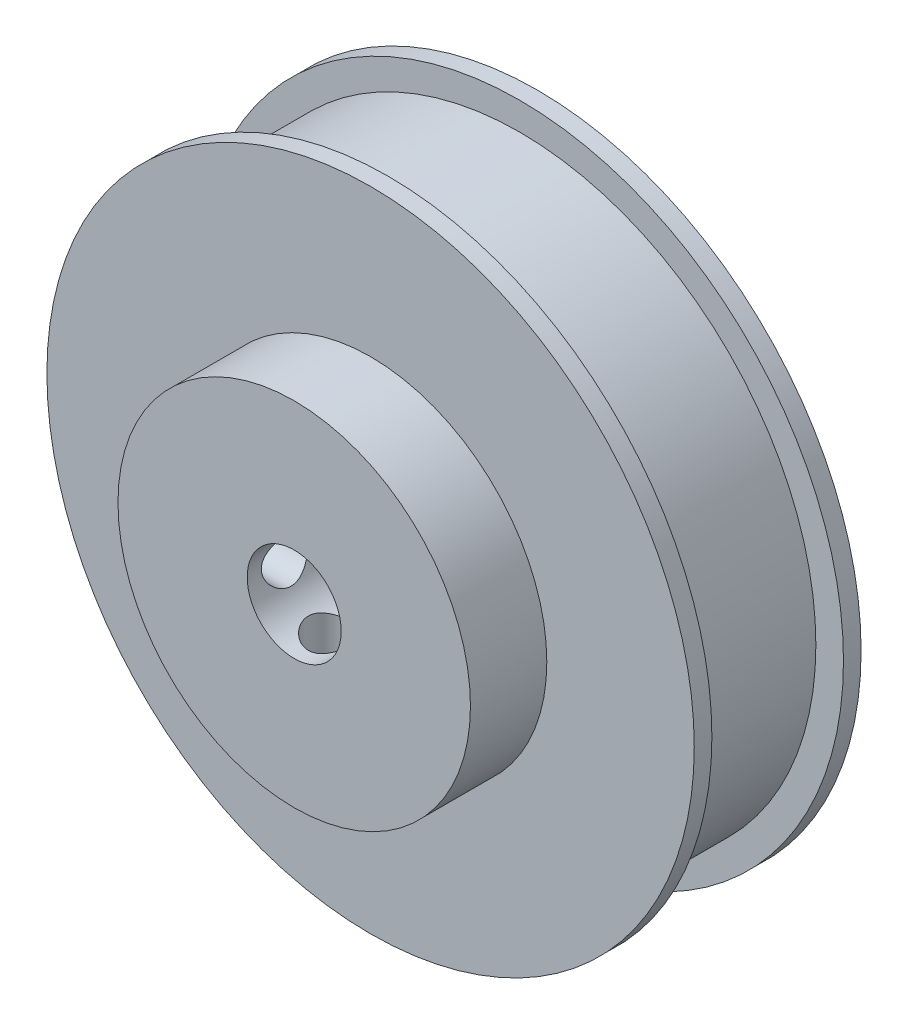
ISO-10303-21;
HEADER;
FILE_DESCRIPTION(('STEP AP214'),'2;1');
FILE_NAME('part.step','',(''),(''),'','','');
FILE_SCHEMA(('AUTOMOTIVE_DESIGN { 1 0 10303 214 1 1 1 1 }'));
ENDSEC;
DATA;
#1=APPLICATION_CONTEXT('core data for automotive mechanical design processes');
#2=APPLICATION_PROTOCOL_DEFINITION('international standard','automotive_design',2000,#1);
#3=PRODUCT_CONTEXT('',#1,'mechanical');
#4=PRODUCT('Part','Part','',(#3));
#5=PRODUCT_RELATED_PRODUCT_CATEGORY('part','',(#4));
#6=PRODUCT_DEFINITION_FORMATION('','',#4);
#7=PRODUCT_DEFINITION_CONTEXT('part definition',#1,'design');
#8=PRODUCT_DEFINITION('design','',#6,#7);
#9=PRODUCT_DEFINITION_SHAPE('','',#8);
#10=(LENGTH_UNIT() NAMED_UNIT(*) SI_UNIT(.MILLI.,.METRE.));
#11=(NAMED_UNIT(*) PLANE_ANGLE_UNIT() SI_UNIT($,.RADIAN.));
#12=(NAMED_UNIT(*) SI_UNIT($,.STERADIAN.) SOLID_ANGLE_UNIT());
#13=UNCERTAINTY_MEASURE_WITH_UNIT(LENGTH_MEASURE(1.E-05),#10,'distance_accuracy_value','');
#14=(GEOMETRIC_REPRESENTATION_CONTEXT(3) GLOBAL_UNCERTAINTY_ASSIGNED_CONTEXT((#13)) GLOBAL_UNIT_ASSIGNED_CONTEXT((#10,
#11,#12)) REPRESENTATION_CONTEXT('',''));
#15=CARTESIAN_POINT('',(0.,0.,0.));
#16=DIRECTION('',(0.,0.,1.));
#17=DIRECTION('',(1.,0.,0.));
#18=AXIS2_PLACEMENT_3D('',#15,#16,#17);
#19=CARTESIAN_POINT('',(0.,0.,14.2));
#20=DIRECTION('',(0.,0.,1.));
#21=DIRECTION('',(1.,0.,0.));
#22=AXIS2_PLACEMENT_3D('',#19,#20,#21);
#23=PLANE('',#22);
#24=CARTESIAN_POINT('',(0.,0.,14.2));
#25=DIRECTION('',(0.,0.,1.));
#26=DIRECTION('',(1.,0.,0.));
#27=AXIS2_PLACEMENT_3D('',#24,#25,#26);
#28=CIRCLE('',#27,27.55);
#29=CARTESIAN_POINT('',(27.55,0.,14.2));
#30=VERTEX_POINT('',#29);
#31=EDGE_CURVE('E144',#30,#30,#28,.T.);
#32=ORIENTED_EDGE('',*,*,#31,.T.);
#33=EDGE_LOOP('',(#32));
#34=FACE_BOUND('',#33,.T.);
#35=CARTESIAN_POINT('',(0.,0.,14.2));
#36=DIRECTION('',(0.,0.,1.));
#37=DIRECTION('',(1.,0.,0.));
#38=AXIS2_PLACEMENT_3D('',#35,#36,#37);
#39=CIRCLE('',#38,15.);
#40=CARTESIAN_POINT('',(15.,0.,14.2));
#41=VERTEX_POINT('',#40);
#42=EDGE_CURVE('E59',#41,#41,#39,.T.);
#43=ORIENTED_EDGE('',*,*,#42,.F.);
#44=EDGE_LOOP('',(#43));
#45=FACE_BOUND('',#44,.T.);
#46=ADVANCED_FACE('F31',(#34,#45),#23,.T.);
#47=CARTESIAN_POINT('',(0.,0.,1.5));
#48=DIRECTION('',(0.,0.,1.));
#49=DIRECTION('',(1.,0.,0.));
#50=AXIS2_PLACEMENT_3D('',#47,#48,#49);
#51=PLANE('',#50);
#52=CARTESIAN_POINT('',(0.,0.,1.5));
#53=DIRECTION('',(0.,0.,1.));
#54=DIRECTION('',(1.,0.,0.));
#55=AXIS2_PLACEMENT_3D('',#52,#53,#54);
#56=CIRCLE('',#55,27.55);
#57=CARTESIAN_POINT('',(27.55,0.,1.5));
#58=VERTEX_POINT('',#57);
#59=EDGE_CURVE('E10',#58,#58,#56,.T.);
#60=ORIENTED_EDGE('',*,*,#59,.T.);
#61=EDGE_LOOP('',(#60));
#62=FACE_BOUND('',#61,.T.);
#63=CARTESIAN_POINT('',(0.,0.,1.5));
#64=DIRECTION('',(0.,0.,1.));
#65=DIRECTION('',(1.,0.,0.));
#66=AXIS2_PLACEMENT_3D('',#63,#64,#65);
#67=CIRCLE('',#66,25.2);
#68=CARTESIAN_POINT('',(25.2,0.,1.5));
#69=VERTEX_POINT('',#68);
#70=EDGE_CURVE('E51',#69,#69,#67,.T.);
#71=ORIENTED_EDGE('',*,*,#70,.F.);
#72=EDGE_LOOP('',(#71));
#73=FACE_BOUND('',#72,.T.);
#74=ADVANCED_FACE('F97',(#62,#73),#51,.T.);
#75=CARTESIAN_POINT('',(0.,0.,1.5));
#76=DIRECTION('',(0.,0.,-1.));
#77=DIRECTION('',(-1.,0.,0.));
#78=AXIS2_PLACEMENT_3D('',#75,#76,#77);
#79=CYLINDRICAL_SURFACE('',#78,27.55);
#80=ORIENTED_EDGE('',*,*,#59,.F.);
#81=EDGE_LOOP('',(#80));
#82=FACE_BOUND('',#81,.T.);
#83=CARTESIAN_POINT('',(0.,0.,0.));
#84=DIRECTION('',(0.,0.,1.));
#85=DIRECTION('',(1.,0.,0.));
#86=AXIS2_PLACEMENT_3D('',#83,#84,#85);
#87=CIRCLE('',#86,27.55);
#88=CARTESIAN_POINT('',(27.55,0.,0.));
#89=VERTEX_POINT('',#88);
#90=EDGE_CURVE('E43',#89,#89,#87,.T.);
#91=ORIENTED_EDGE('',*,*,#90,.T.);
#92=EDGE_LOOP('',(#91));
#93=FACE_BOUND('',#92,.T.);
#94=ADVANCED_FACE('F33',(#82,#93),#79,.T.);
#95=CARTESIAN_POINT('',(0.,0.,0.));
#96=DIRECTION('',(0.,0.,1.));
#97=DIRECTION('',(1.,0.,0.));
#98=AXIS2_PLACEMENT_3D('',#95,#96,#97);
#99=PLANE('',#98);
#100=CARTESIAN_POINT('',(0.,0.,0.));
#101=DIRECTION('',(0.,0.,1.));
#102=DIRECTION('',(1.,0.,0.));
#103=AXIS2_PLACEMENT_3D('',#100,#101,#102);
#104=CIRCLE('',#103,4.);
#105=CARTESIAN_POINT('',(4.,0.,0.));
#106=VERTEX_POINT('',#105);
#107=EDGE_CURVE('E127',#106,#106,#104,.T.);
#108=ORIENTED_EDGE('',*,*,#107,.T.);
#109=EDGE_LOOP('',(#108));
#110=FACE_BOUND('',#109,.T.);
#111=ORIENTED_EDGE('',*,*,#90,.F.);
#112=EDGE_LOOP('',(#111));
#113=FACE_BOUND('',#112,.T.);
#114=ADVANCED_FACE('F116',(#110,#113),#99,.F.);
#115=CARTESIAN_POINT('',(0.,0.,12.7));
#116=DIRECTION('',(0.,0.,-1.));
#117=DIRECTION('',(-1.,0.,0.));
#118=AXIS2_PLACEMENT_3D('',#115,#116,#117);
#119=CYLINDRICAL_SURFACE('',#118,25.2);
#120=CARTESIAN_POINT('',(0.,0.,12.7));
#121=DIRECTION('',(0.,0.,1.));
#122=DIRECTION('',(1.,0.,0.));
#123=AXIS2_PLACEMENT_3D('',#120,#121,#122);
#124=CIRCLE('',#123,25.2);
#125=CARTESIAN_POINT('',(25.2,0.,12.7));
#126=VERTEX_POINT('',#125);
#127=EDGE_CURVE('E48',#126,#126,#124,.T.);
#128=ORIENTED_EDGE('',*,*,#127,.F.);
#129=EDGE_LOOP('',(#128));
#130=FACE_BOUND('',#129,.T.);
#131=ORIENTED_EDGE('',*,*,#70,.T.);
#132=EDGE_LOOP('',(#131));
#133=FACE_BOUND('',#132,.T.);
#134=ADVANCED_FACE('F110',(#130,#133),#119,.T.);
#135=CARTESIAN_POINT('',(0.,0.,12.7));
#136=DIRECTION('',(0.,0.,1.));
#137=DIRECTION('',(1.,0.,0.));
#138=AXIS2_PLACEMENT_3D('',#135,#136,#137);
#139=PLANE('',#138);
#140=CARTESIAN_POINT('',(0.,0.,12.7));
#141=DIRECTION('',(0.,0.,1.));
#142=DIRECTION('',(1.,0.,0.));
#143=AXIS2_PLACEMENT_3D('',#140,#141,#142);
#144=CIRCLE('',#143,27.55);
#145=CARTESIAN_POINT('',(27.55,0.,12.7));
#146=VERTEX_POINT('',#145);
#147=EDGE_CURVE('E142',#146,#146,#144,.T.);
#148=ORIENTED_EDGE('',*,*,#147,.F.);
#149=EDGE_LOOP('',(#148));
#150=FACE_BOUND('',#149,.T.);
#151=ORIENTED_EDGE('',*,*,#127,.T.);
#152=EDGE_LOOP('',(#151));
#153=FACE_BOUND('',#152,.T.);
#154=ADVANCED_FACE('F106',(#150,#153),#139,.F.);
#155=CARTESIAN_POINT('',(0.,0.,14.2));
#156=DIRECTION('',(0.,0.,-1.));
#157=DIRECTION('',(-1.,0.,0.));
#158=AXIS2_PLACEMENT_3D('',#155,#156,#157);
#159=CYLINDRICAL_SURFACE('',#158,27.55);
#160=ORIENTED_EDGE('',*,*,#31,.F.);
#161=EDGE_LOOP('',(#160));
#162=FACE_BOUND('',#161,.T.);
#163=ORIENTED_EDGE('',*,*,#147,.T.);
#164=EDGE_LOOP('',(#163));
#165=FACE_BOUND('',#164,.T.);
#166=ADVANCED_FACE('F109',(#162,#165),#159,.T.);
#167=CARTESIAN_POINT('',(0.,0.,20.7));
#168=DIRECTION('',(0.,0.,-1.));
#169=DIRECTION('',(-1.,0.,0.));
#170=AXIS2_PLACEMENT_3D('',#167,#168,#169);
#171=CYLINDRICAL_SURFACE('',#170,15.);
#172=CARTESIAN_POINT('',(-15.,0.,19.5));
#173=CARTESIAN_POINT('',(-14.9999983574254,-0.111808835669284,19.4999952902931));
#174=CARTESIAN_POINT('',(-14.9987367072719,-0.22368597927628,19.4905924620375));
#175=CARTESIAN_POINT('',(-14.993825111269,-0.444322725138079,19.4532336509504));
#176=CARTESIAN_POINT('',(-14.9901727244172,-0.553079022333037,19.4252587051029));
#177=CARTESIAN_POINT('',(-14.9808907984907,-0.764248312626984,19.3515982824586));
#178=CARTESIAN_POINT('',(-14.9752626421097,-0.866665683058493,19.3059251889616));
#179=CARTESIAN_POINT('',(-14.9626538666039,-1.0623638950303,19.1981930861937));
#180=CARTESIAN_POINT('',(-14.9556734655857,-1.15564620633703,19.1361367188335));
#181=CARTESIAN_POINT('',(-14.9410899478996,-1.33102582250468,18.9969867383958));
#182=CARTESIAN_POINT('',(-14.9334835816211,-1.41305798549586,18.9198113549915));
#183=CARTESIAN_POINT('',(-14.9185313755795,-1.56304735673102,18.7527898109233));
#184=CARTESIAN_POINT('',(-14.9111855496234,-1.63100381997221,18.6629429800042));
#185=CARTESIAN_POINT('',(-14.8975543544019,-1.75115902268907,18.472700877055));
#186=CARTESIAN_POINT('',(-14.8912731776576,-1.80329607482578,18.3722663175214));
#187=CARTESIAN_POINT('',(-14.8805258737923,-1.8899384500729,18.1639689327632));
#188=CARTESIAN_POINT('',(-14.8760596685121,-1.92444453245278,18.0561064276467));
#189=CARTESIAN_POINT('',(-14.8694793656867,-1.97464606772174,17.8366941894984));
#190=CARTESIAN_POINT('',(-14.8673514537014,-1.99045204228507,17.7251701654671));
#191=CARTESIAN_POINT('',(-14.8656465160931,-2.00314680548117,17.501033820394));
#192=CARTESIAN_POINT('',(-14.866069374204,-2.00003645633601,17.3884215491891));
#193=CARTESIAN_POINT('',(-14.8694055577299,-1.97507745939235,17.1660788699721));
#194=CARTESIAN_POINT('',(-14.8723026462234,-1.95335097531762,17.0563344701143));
#195=CARTESIAN_POINT('',(-14.8802355277475,-1.89196724634372,16.8420631632399));
#196=CARTESIAN_POINT('',(-14.8852713695413,-1.85230959261458,16.737536375245));
#197=CARTESIAN_POINT('',(-14.8969326111103,-1.75605929143191,16.5362903652928));
#198=CARTESIAN_POINT('',(-14.903562941239,-1.69941397913749,16.4395966288057));
#199=CARTESIAN_POINT('',(-14.9176623621993,-1.57083393344289,16.2570409180823));
#200=CARTESIAN_POINT('',(-14.9251314966353,-1.49889840502385,16.1711795074458));
#201=CARTESIAN_POINT('',(-14.9401389923359,-1.34110490026363,16.0120169874181));
#202=CARTESIAN_POINT('',(-14.947677435412,-1.25514170702645,15.9388201572977));
#203=CARTESIAN_POINT('',(-14.9619192381826,-1.07209417013341,15.8078779550716));
#204=CARTESIAN_POINT('',(-14.9686225954715,-0.975009794442371,15.7501326274765));
#205=CARTESIAN_POINT('',(-14.9804439374358,-0.772392219730472,15.6517308823053));
#206=CARTESIAN_POINT('',(-14.9855612720896,-0.666855578841232,15.6110814689537));
#207=CARTESIAN_POINT('',(-14.9936282590407,-0.450370924336252,15.5481106810277));
#208=CARTESIAN_POINT('',(-14.9965780268993,-0.33942319954226,15.5257883293606));
#209=CARTESIAN_POINT('',(-14.9999624137686,-0.116166903325648,15.5002415672289));
#210=CARTESIAN_POINT('',(-15.0004159384905,-0.00387503454704613,15.4968735982165));
#211=CARTESIAN_POINT('',(-14.9988079153852,0.219671617218714,15.5089516641272));
#212=CARTESIAN_POINT('',(-14.996746428686,0.330926425345661,15.5243972417824));
#213=CARTESIAN_POINT('',(-14.990351753581,0.548813715572934,15.573544653384));
#214=CARTESIAN_POINT('',(-14.9860271430292,0.655462016512041,15.6071775683222));
#215=CARTESIAN_POINT('',(-14.9755900925429,0.861605098793556,15.6916729659371));
#216=CARTESIAN_POINT('',(-14.9694775843944,0.961099607015634,15.7425361060133));
#217=CARTESIAN_POINT('',(-14.9560983737007,1.15074887861607,15.8603921555833));
#218=CARTESIAN_POINT('',(-14.9488251504572,1.2408458143966,15.9274773657133));
#219=CARTESIAN_POINT('',(-14.9339572870998,1.40855294699189,16.0757433292243));
#220=CARTESIAN_POINT('',(-14.9263626324062,1.48616257662378,16.1569247225164));
#221=CARTESIAN_POINT('',(-14.9116490247351,1.62720549423098,16.3317131426396));
#222=CARTESIAN_POINT('',(-14.904533487753,1.69054327608938,16.4253975667382));
#223=CARTESIAN_POINT('',(-14.8916413300182,1.80058351078813,16.6221594102809));
#224=CARTESIAN_POINT('',(-14.8858646793678,1.84728633510346,16.7252366199104));
#225=CARTESIAN_POINT('',(-14.8763281178008,1.92257836500746,16.9375572420277));
#226=CARTESIAN_POINT('',(-14.872562342326,1.95122028846795,17.0467816852108));
#227=CARTESIAN_POINT('',(-14.8674574869829,1.98974667143958,17.2685436321288));
#228=CARTESIAN_POINT('',(-14.8661182773134,1.99963213426781,17.3810809583244));
#229=CARTESIAN_POINT('',(-14.8660223129545,2.00034485806189,17.6053234908535));
#230=CARTESIAN_POINT('',(-14.8672452228252,1.99132219194492,17.7170282409642));
#231=CARTESIAN_POINT('',(-14.872091838742,1.95479376686689,17.9373178751039));
#232=CARTESIAN_POINT('',(-14.8757155438883,1.92728801483268,18.045902760302));
#233=CARTESIAN_POINT('',(-14.8849489027276,1.85462310332207,18.2568436832516));
#234=CARTESIAN_POINT('',(-14.890557626594,1.80947220819041,18.3592026111169));
#235=CARTESIAN_POINT('',(-14.9031304571282,1.70281342759737,18.5549158838261));
#236=CARTESIAN_POINT('',(-14.910094589966,1.64130522630428,18.648270054756));
#237=CARTESIAN_POINT('',(-14.9246596718306,1.50312448509508,18.8240896499284));
#238=CARTESIAN_POINT('',(-14.9322650575408,1.42634027226901,18.9064669477551));
#239=CARTESIAN_POINT('',(-14.9472171900166,1.26002169349824,19.0572232163615));
#240=CARTESIAN_POINT('',(-14.9545638756898,1.17048434072977,19.1255988987502));
#241=CARTESIAN_POINT('',(-14.9682063513753,0.980752987852819,19.2466671384665));
#242=CARTESIAN_POINT('',(-14.9744974642689,0.880514620743964,19.2992906665552));
#243=CARTESIAN_POINT('',(-14.9852732065897,0.672592409587328,19.3868805985451));
#244=CARTESIAN_POINT('',(-14.9897597692431,0.564916678969889,19.4218659086249));
#245=CARTESIAN_POINT('',(-14.9953572174327,0.380588408098419,19.4649480063852));
#246=CARTESIAN_POINT('',(-14.9970896363507,0.305091081955779,19.4780732435236));
#247=CARTESIAN_POINT('',(-14.9994115849077,0.153073171616112,19.4956008141655));
#248=CARTESIAN_POINT('',(-15.000001124628,0.0765525964512405,19.5000032246136));
#249=CARTESIAN_POINT('',(-15.,0.,19.5));
#250=B_SPLINE_CURVE_WITH_KNOTS('',3,(#172,#173,#174,#175,#176,#177,#178,#179,#180,#181,#182,
#183,#184,#185,#186,#187,#188,#189,#190,#191,#192,#193,#194,#195,#196,#197,#198,#199,#200,#201,
#202,#203,#204,#205,#206,#207,#208,#209,#210,#211,#212,#213,#214,#215,#216,#217,#218,#219,#220,
#221,#222,#223,#224,#225,#226,#227,#228,#229,#230,#231,#232,#233,#234,#235,#236,#237,#238,#239,
#240,#241,#242,#243,#244,#245,#246,#247,#248,#249),.UNSPECIFIED.,.T.,.F.,(4,2,2,2,2,2,2,2,2,2,2,
2,2,2,2,2,2,2,2,2,2,2,2,2,2,2,2,2,2,2,2,2,2,2,2,2,2,2,4),(0.,0.335146851305743,
0.670636430885044,1.0058916928274,1.34109292564034,1.67815978443559,2.01524447904836,
2.35362721511647,2.69199537766204,3.02835355914359,3.3646964092492,3.69884885098043,
4.0330089117585,4.36821583137897,4.70344018443797,5.0413054448485,5.37917167852296,
5.71717620202539,6.05516270391743,6.39058584992061,6.72600084354478,7.06015363396463,
7.39431917503546,7.73043274769884,8.06656158258761,8.4048770453545,8.74318495273048,
9.08050074735454,9.41779849783634,9.75242927496624,10.0870599266875,10.4215340370262,
10.756014605959,11.0930366783511,11.4301378125116,11.7686952667451,12.1068890499242,
12.3363573904731,12.5658237068544),.UNSPECIFIED.);
#251=CARTESIAN_POINT('',(-15.,0.,19.5));
#252=VERTEX_POINT('',#251);
#253=EDGE_CURVE('E60',#252,#252,#250,.T.);
#254=ORIENTED_EDGE('',*,*,#253,.T.);
#255=EDGE_LOOP('',(#254));
#256=FACE_BOUND('',#255,.T.);
#257=CARTESIAN_POINT('',(0.,-15.,19.5));
#258=CARTESIAN_POINT('',(0.111808835669287,-14.9999983574254,19.4999952902931));
#259=CARTESIAN_POINT('',(0.223685979276282,-14.9987367072719,19.4905924620375));
#260=CARTESIAN_POINT('',(0.444322725138081,-14.993825111269,19.4532336509504));
#261=CARTESIAN_POINT('',(0.553079022333039,-14.9901727244172,19.4252587051029));
#262=CARTESIAN_POINT('',(0.764248312626988,-14.9808907984907,19.3515982824585));
#263=CARTESIAN_POINT('',(0.866665683058498,-14.9752626421097,19.3059251889616));
#264=CARTESIAN_POINT('',(1.0623638950303,-14.9626538666039,19.1981930861937));
#265=CARTESIAN_POINT('',(1.15564620633703,-14.9556734655857,19.1361367188335));
#266=CARTESIAN_POINT('',(1.33102582250468,-14.9410899478996,18.9969867383958));
#267=CARTESIAN_POINT('',(1.41305798549587,-14.9334835816211,18.9198113549915));
#268=CARTESIAN_POINT('',(1.56304735673102,-14.9185313755795,18.7527898109233));
#269=CARTESIAN_POINT('',(1.63100381997222,-14.9111855496234,18.6629429800042));
#270=CARTESIAN_POINT('',(1.75115902268908,-14.8975543544019,18.472700877055));
#271=CARTESIAN_POINT('',(1.80329607482578,-14.8912731776576,18.3722663175214));
#272=CARTESIAN_POINT('',(1.88993845007291,-14.8805258737923,18.1639689327632));
#273=CARTESIAN_POINT('',(1.92444453245278,-14.8760596685121,18.0561064276467));
#274=CARTESIAN_POINT('',(1.97464606772174,-14.8694793656867,17.8366941894983));
#275=CARTESIAN_POINT('',(1.99045204228507,-14.8673514537014,17.7251701654671));
#276=CARTESIAN_POINT('',(2.00314680548118,-14.8656465160931,17.501033820394));
#277=CARTESIAN_POINT('',(2.00003645633601,-14.866069374204,17.3884215491891));
#278=CARTESIAN_POINT('',(1.97507745939235,-14.8694055577299,17.1660788699721));
#279=CARTESIAN_POINT('',(1.95335097531762,-14.8723026462234,17.0563344701143));
#280=CARTESIAN_POINT('',(1.89196724634372,-14.8802355277475,16.8420631632399));
#281=CARTESIAN_POINT('',(1.85230959261458,-14.8852713695413,16.737536375245));
#282=CARTESIAN_POINT('',(1.75605929143191,-14.8969326111103,16.5362903652928));
#283=CARTESIAN_POINT('',(1.69941397913749,-14.903562941239,16.4395966288057));
#284=CARTESIAN_POINT('',(1.57083393344289,-14.9176623621993,16.2570409180823));
#285=CARTESIAN_POINT('',(1.49889840502385,-14.9251314966353,16.1711795074458));
#286=CARTESIAN_POINT('',(1.34110490026363,-14.9401389923359,16.0120169874181));
#287=CARTESIAN_POINT('',(1.25514170702645,-14.947677435412,15.9388201572977));
#288=CARTESIAN_POINT('',(1.07209417013341,-14.9619192381826,15.8078779550716));
#289=CARTESIAN_POINT('',(0.97500979444237,-14.9686225954715,15.7501326274765));
#290=CARTESIAN_POINT('',(0.772392219730471,-14.9804439374358,15.6517308823053));
#291=CARTESIAN_POINT('',(0.666855578841231,-14.9855612720896,15.6110814689537));
#292=CARTESIAN_POINT('',(0.45037092433625,-14.9936282590407,15.5481106810277));
#293=CARTESIAN_POINT('',(0.339423199542258,-14.9965780268993,15.5257883293606));
#294=CARTESIAN_POINT('',(0.116166903325644,-14.9999624137686,15.5002415672289));
#295=CARTESIAN_POINT('',(0.00387503454704304,-15.0004159384905,15.4968735982165));
#296=CARTESIAN_POINT('',(-0.219671617218717,-14.9988079153852,15.5089516641272));
#297=CARTESIAN_POINT('',(-0.330926425345664,-14.996746428686,15.5243972417824));
#298=CARTESIAN_POINT('',(-0.548813715572937,-14.990351753581,15.573544653384));
#299=CARTESIAN_POINT('',(-0.655462016512044,-14.9860271430292,15.6071775683222));
#300=CARTESIAN_POINT('',(-0.861605098793559,-14.9755900925429,15.6916729659371));
#301=CARTESIAN_POINT('',(-0.961099607015637,-14.9694775843944,15.7425361060133));
#302=CARTESIAN_POINT('',(-1.15074887861608,-14.9560983737007,15.8603921555833));
#303=CARTESIAN_POINT('',(-1.2408458143966,-14.9488251504572,15.9274773657133));
#304=CARTESIAN_POINT('',(-1.40855294699189,-14.9339572870998,16.0757433292243));
#305=CARTESIAN_POINT('',(-1.48616257662378,-14.9263626324062,16.1569247225164));
#306=CARTESIAN_POINT('',(-1.62720549423098,-14.9116490247351,16.3317131426396));
#307=CARTESIAN_POINT('',(-1.69054327608938,-14.904533487753,16.4253975667382));
#308=CARTESIAN_POINT('',(-1.80058351078814,-14.8916413300182,16.6221594102809));
#309=CARTESIAN_POINT('',(-1.84728633510346,-14.8858646793678,16.7252366199104));
#310=CARTESIAN_POINT('',(-1.92257836500746,-14.8763281178008,16.9375572420277));
#311=CARTESIAN_POINT('',(-1.95122028846795,-14.872562342326,17.0467816852108));
#312=CARTESIAN_POINT('',(-1.98974667143959,-14.8674574869829,17.2685436321288));
#313=CARTESIAN_POINT('',(-1.99963213426782,-14.8661182773134,17.3810809583244));
#314=CARTESIAN_POINT('',(-2.00034485806189,-14.8660223129545,17.6053234908535));
#315=CARTESIAN_POINT('',(-1.99132219194492,-14.8672452228252,17.7170282409642));
#316=CARTESIAN_POINT('',(-1.95479376686689,-14.872091838742,17.9373178751039));
#317=CARTESIAN_POINT('',(-1.92728801483268,-14.8757155438883,18.045902760302));
#318=CARTESIAN_POINT('',(-1.85462310332207,-14.8849489027276,18.2568436832516));
#319=CARTESIAN_POINT('',(-1.80947220819041,-14.890557626594,18.3592026111169));
#320=CARTESIAN_POINT('',(-1.70281342759737,-14.9031304571282,18.5549158838261));
#321=CARTESIAN_POINT('',(-1.64130522630428,-14.910094589966,18.648270054756));
#322=CARTESIAN_POINT('',(-1.50312448509508,-14.9246596718306,18.8240896499284));
#323=CARTESIAN_POINT('',(-1.42634027226901,-14.9322650575408,18.9064669477551));
#324=CARTESIAN_POINT('',(-1.26002169349823,-14.9472171900166,19.0572232163615));
#325=CARTESIAN_POINT('',(-1.17048434072977,-14.9545638756898,19.1255988987503));
#326=CARTESIAN_POINT('',(-0.980752987852821,-14.9682063513753,19.2466671384665));
#327=CARTESIAN_POINT('',(-0.880514620743962,-14.9744974642689,19.2992906665552));
#328=CARTESIAN_POINT('',(-0.672592409587325,-14.9852732065897,19.3868805985451));
#329=CARTESIAN_POINT('',(-0.564916678969886,-14.9897597692431,19.4218659086249));
#330=CARTESIAN_POINT('',(-0.380588408098415,-14.9953572174327,19.4649480063852));
#331=CARTESIAN_POINT('',(-0.305091081955775,-14.9970896363507,19.4780732435236));
#332=CARTESIAN_POINT('',(-0.153073171616109,-14.9994115849077,19.4956008141655));
#333=CARTESIAN_POINT('',(-0.0765525964512377,-15.000001124628,19.5000032246136));
#334=CARTESIAN_POINT('',(0.,-15.,19.5));
#335=B_SPLINE_CURVE_WITH_KNOTS('',3,(#257,#258,#259,#260,#261,#262,#263,#264,#265,#266,#267,
#268,#269,#270,#271,#272,#273,#274,#275,#276,#277,#278,#279,#280,#281,#282,#283,#284,#285,#286,
#287,#288,#289,#290,#291,#292,#293,#294,#295,#296,#297,#298,#299,#300,#301,#302,#303,#304,#305,
#306,#307,#308,#309,#310,#311,#312,#313,#314,#315,#316,#317,#318,#319,#320,#321,#322,#323,#324,
#325,#326,#327,#328,#329,#330,#331,#332,#333,#334),.UNSPECIFIED.,.T.,.F.,(4,2,2,2,2,2,2,2,2,2,2,
2,2,2,2,2,2,2,2,2,2,2,2,2,2,2,2,2,2,2,2,2,2,2,2,2,2,2,4),(0.,0.335146851305743,
0.670636430885046,1.00589169282741,1.34109292564035,1.67815978443559,2.01524447904836,
2.35362721511648,2.69199537766205,3.02835355914359,3.3646964092492,3.69884885098043,
4.0330089117585,4.36821583137898,4.70344018443797,5.0413054448485,5.37917167852296,
5.71717620202539,6.05516270391743,6.39058584992061,6.72600084354479,7.06015363396464,
7.39431917503546,7.73043274769884,8.06656158258762,8.4048770453545,8.74318495273048,
9.08050074735455,9.41779849783635,9.75242927496625,10.0870599266875,10.4215340370262,
10.756014605959,11.0930366783511,11.4301378125116,11.7686952667452,12.1068890499242,
12.3363573904731,12.5658237068544),.UNSPECIFIED.);
#336=CARTESIAN_POINT('',(0.,-15.,19.5));
#337=VERTEX_POINT('',#336);
#338=EDGE_CURVE('E53',#337,#337,#335,.T.);
#339=ORIENTED_EDGE('',*,*,#338,.T.);
#340=EDGE_LOOP('',(#339));
#341=FACE_BOUND('',#340,.T.);
#342=CARTESIAN_POINT('',(0.,0.,20.7));
#343=DIRECTION('',(0.,0.,1.));
#344=DIRECTION('',(1.,0.,0.));
#345=AXIS2_PLACEMENT_3D('',#342,#343,#344);
#346=CIRCLE('',#345,15.);
#347=CARTESIAN_POINT('',(15.,0.,20.7));
#348=VERTEX_POINT('',#347);
#349=EDGE_CURVE('E140',#348,#348,#346,.T.);
#350=ORIENTED_EDGE('',*,*,#349,.F.);
#351=EDGE_LOOP('',(#350));
#352=FACE_BOUND('',#351,.T.);
#353=ORIENTED_EDGE('',*,*,#42,.T.);
#354=EDGE_LOOP('',(#353));
#355=FACE_BOUND('',#354,.T.);
#356=ADVANCED_FACE('F61',(#256,#341,#352,#355),#171,.T.);
#357=CARTESIAN_POINT('',(0.,0.,20.7));
#358=DIRECTION('',(0.,0.,1.));
#359=DIRECTION('',(1.,0.,0.));
#360=AXIS2_PLACEMENT_3D('',#357,#358,#359);
#361=PLANE('',#360);
#362=CARTESIAN_POINT('',(0.,0.,20.7));
#363=DIRECTION('',(0.,0.,1.));
#364=DIRECTION('',(1.,0.,0.));
#365=AXIS2_PLACEMENT_3D('',#362,#363,#364);
#366=CIRCLE('',#365,4.);
#367=CARTESIAN_POINT('',(4.,0.,20.7));
#368=VERTEX_POINT('',#367);
#369=EDGE_CURVE('E80',#368,#368,#366,.T.);
#370=ORIENTED_EDGE('',*,*,#369,.F.);
#371=EDGE_LOOP('',(#370));
#372=FACE_BOUND('',#371,.T.);
#373=ORIENTED_EDGE('',*,*,#349,.T.);
#374=EDGE_LOOP('',(#373));
#375=FACE_BOUND('',#374,.T.);
#376=ADVANCED_FACE('F69',(#372,#375),#361,.T.);
#377=CARTESIAN_POINT('',(0.,-27.55,17.5));
#378=DIRECTION('',(0.,1.,0.));
#379=DIRECTION('',(0.,0.,1.));
#380=AXIS2_PLACEMENT_3D('',#377,#378,#379);
#381=CYLINDRICAL_SURFACE('',#380,2.);
#382=CARTESIAN_POINT('',(0.,-4.,19.5));
#383=CARTESIAN_POINT('',(0.105143925902469,-3.99999426810082,19.4999933953656));
#384=CARTESIAN_POINT('',(0.210413199395127,-3.99580982039513,19.4916598537579));
#385=CARTESIAN_POINT('',(0.417840470537794,-3.97948312074314,19.4586942393169));
#386=CARTESIAN_POINT('',(0.519992173427261,-3.96732575657839,19.4340312140044));
#387=CARTESIAN_POINT('',(0.7178670897609,-3.93632558806751,19.3696123827667));
#388=CARTESIAN_POINT('',(0.813613605878295,-3.91750878355075,19.3299152315041));
#389=CARTESIAN_POINT('',(0.9969452336132,-3.87491553031523,19.23685875727));
#390=CARTESIAN_POINT('',(1.08453098798012,-3.8511394726705,19.1835005115023));
#391=CARTESIAN_POINT('',(1.25501563552382,-3.79912516516124,19.0609655010294));
#392=CARTESIAN_POINT('',(1.33731042224422,-3.77070398255074,18.9910270415207));
#393=CARTESIAN_POINT('',(1.48955888973396,-3.71319940493486,18.8389570415059));
#394=CARTESIAN_POINT('',(1.55950316621354,-3.68411552418069,18.7568162964551));
#395=CARTESIAN_POINT('',(1.69050400090056,-3.62597902394695,18.5750333009532));
#396=CARTESIAN_POINT('',(1.75045067110328,-3.59710373940264,18.4745278033082));
#397=CARTESIAN_POINT('',(1.85233645378139,-3.54571957544641,18.2632653280276));
#398=CARTESIAN_POINT('',(1.89428842993267,-3.52320615213979,18.1525157425545));
#399=CARTESIAN_POINT('',(1.95626488437718,-3.48915734075617,17.9306697891562));
#400=CARTESIAN_POINT('',(1.97745171416089,-3.47704543167427,17.8199910958652));
#401=CARTESIAN_POINT('',(2.0008539866177,-3.46363779897055,17.596042324441));
#402=CARTESIAN_POINT('',(2.00308817674615,-3.46233138686576,17.4827749182577));
#403=CARTESIAN_POINT('',(1.98937457434459,-3.47021860514497,17.2714279513693));
#404=CARTESIAN_POINT('',(1.97556911907365,-3.47817527324027,17.1731519375539));
#405=CARTESIAN_POINT('',(1.93387969811387,-3.501524574677,16.9805561812539));
#406=CARTESIAN_POINT('',(1.90599124779531,-3.51691957663552,16.8862377093894));
#407=CARTESIAN_POINT('',(1.83641956077201,-3.55374952825482,16.7015417348687));
#408=CARTESIAN_POINT('',(1.79443013423199,-3.57531681327997,16.6113072024284));
#409=CARTESIAN_POINT('',(1.69808337533601,-3.62206808562807,16.43873141482));
#410=CARTESIAN_POINT('',(1.64372048762494,-3.64725369560381,16.3563937287998));
#411=CARTESIAN_POINT('',(1.51613210982558,-3.70226315806571,16.1909574945136));
#412=CARTESIAN_POINT('',(1.44138891673857,-3.73227020473492,16.1090862528477));
#413=CARTESIAN_POINT('',(1.27911115748275,-3.79095246600814,15.9585291628182));
#414=CARTESIAN_POINT('',(1.19157051314857,-3.81962703917602,15.8898496159322));
#415=CARTESIAN_POINT('',(1.0010330116637,-3.87403974565928,15.7646286779405));
#416=CARTESIAN_POINT('',(0.897507183198821,-3.89957968324014,15.7087990551085));
#417=CARTESIAN_POINT('',(0.680932430977597,-3.94315762242485,15.615805941914));
#418=CARTESIAN_POINT('',(0.567891152530555,-3.96120157887106,15.5786276299697));
#419=CARTESIAN_POINT('',(0.345532983321407,-3.98648667482871,15.5270491925666));
#420=CARTESIAN_POINT('',(0.236683061096655,-3.9944987660262,15.5110175285064));
#421=CARTESIAN_POINT('',(0.0175591998987058,-4.00146026918207,15.497070537731));
#422=CARTESIAN_POINT('',(-0.0927140397398148,-4.00041397442637,15.4991466287211));
#423=CARTESIAN_POINT('',(-0.302465943971971,-3.9898238450687,15.5204133768375));
#424=CARTESIAN_POINT('',(-0.402118816099857,-3.98094491376337,15.53826506546));
#425=CARTESIAN_POINT('',(-0.596813784603879,-3.95644342629681,15.5884761437902));
#426=CARTESIAN_POINT('',(-0.691855371382171,-3.94082012668824,15.620837132907));
#427=CARTESIAN_POINT('',(-0.877777216899143,-3.90368502827176,15.6999969328661));
#428=CARTESIAN_POINT('',(-0.968460794011604,-3.88201763539262,15.7471821002326));
#429=CARTESIAN_POINT('',(-1.14092272339854,-3.83487948634835,15.8542150712931));
#430=CARTESIAN_POINT('',(-1.22269725955318,-3.80940711133877,15.9140682691908));
#431=CARTESIAN_POINT('',(-1.38353537857843,-3.75416442672396,16.0515208506614));
#432=CARTESIAN_POINT('',(-1.46154415563805,-3.72421769686999,16.1302857368903));
#433=CARTESIAN_POINT('',(-1.60371264223771,-3.6652478321764,16.2998503025555));
#434=CARTESIAN_POINT('',(-1.66786277142374,-3.63622534800094,16.3906582376958));
#435=CARTESIAN_POINT('',(-1.78341582895803,-3.58102384412979,16.5872873083459));
#436=CARTESIAN_POINT('',(-1.83405099160049,-3.55505059178122,16.693622532189));
#437=CARTESIAN_POINT('',(-1.91616565186941,-3.5114814458827,16.9150201351499));
#438=CARTESIAN_POINT('',(-1.94766983173403,-3.493874764435,17.0300710529338));
#439=CARTESIAN_POINT('',(-1.98772337493374,-3.47123002051604,17.2538204457694));
#440=CARTESIAN_POINT('',(-1.9981859928109,-3.4651476693013,17.3620685068705));
#441=CARTESIAN_POINT('',(-2.0013783087524,-3.46330709283207,17.5788941343291));
#442=CARTESIAN_POINT('',(-1.99411569324648,-3.4675443925278,17.6874715374757));
#443=CARTESIAN_POINT('',(-1.96385225118662,-3.48475724102153,17.8909670030669));
#444=CARTESIAN_POINT('',(-1.94241662868607,-3.49686188965317,17.9862009402895));
#445=CARTESIAN_POINT('',(-1.88635071644882,-3.52742032375305,18.1716162388487));
#446=CARTESIAN_POINT('',(-1.85171618231984,-3.54587615139337,18.2617959641841));
#447=CARTESIAN_POINT('',(-1.76763149060113,-3.58857060729071,18.4412497019731));
#448=CARTESIAN_POINT('',(-1.7173422756314,-3.61311444791841,18.5300558036581));
#449=CARTESIAN_POINT('',(-1.60430194327479,-3.66470663269721,18.6985490723625));
#450=CARTESIAN_POINT('',(-1.54154434248312,-3.69175627591221,18.7782314610422));
#451=CARTESIAN_POINT('',(-1.39640665332275,-3.74924646316184,18.9362839647094));
#452=CARTESIAN_POINT('',(-1.31256884599452,-3.77969966613256,19.0133182047006));
#453=CARTESIAN_POINT('',(-1.13230961246639,-3.83755504519861,19.1525259668705));
#454=CARTESIAN_POINT('',(-1.03588144661039,-3.8649555725239,19.2146914789398));
#455=CARTESIAN_POINT('',(-0.831863193565888,-3.91396019133075,19.3224727254241));
#456=CARTESIAN_POINT('',(-0.724199007553458,-3.93552192987866,19.3679683384729));
#457=CARTESIAN_POINT('',(-0.501484202276171,-3.97002682597974,19.4396163355148));
#458=CARTESIAN_POINT('',(-0.386455599178199,-3.98299446726136,19.4658236936114));
#459=CARTESIAN_POINT('',(-0.22520389298179,-3.99390923826956,19.4877948221715));
#460=CARTESIAN_POINT('',(-0.180323758883129,-3.99618730680502,19.4923652817327));
#461=CARTESIAN_POINT('',(-0.0903034636101822,-3.99923393953631,19.4984693310282));
#462=CARTESIAN_POINT('',(-0.0451632952932553,-4.00000246206762,19.5000028369404));
#463=CARTESIAN_POINT('',(0.,-4.,19.5));
#464=B_SPLINE_CURVE_WITH_KNOTS('',3,(#382,#383,#384,#385,#386,#387,#388,#389,#390,#391,#392,
#393,#394,#395,#396,#397,#398,#399,#400,#401,#402,#403,#404,#405,#406,#407,#408,#409,#410,#411,
#412,#413,#414,#415,#416,#417,#418,#419,#420,#421,#422,#423,#424,#425,#426,#427,#428,#429,#430,
#431,#432,#433,#434,#435,#436,#437,#438,#439,#440,#441,#442,#443,#444,#445,#446,#447,#448,#449,
#450,#451,#452,#453,#454,#455,#456,#457,#458,#459,#460,#461,#462,#463),.UNSPECIFIED.,.T.,.F.,(4,
2,2,2,2,2,2,2,2,2,2,2,2,2,2,2,2,2,2,2,2,2,2,2,2,2,2,2,2,2,2,2,2,2,2,2,2,2,2,2,4),(0.,
0.315248514840585,0.631096299418396,0.945724310984597,1.26032752116314,1.59396351743618,
1.92785247530807,2.28763452861505,2.64715895796562,2.98516024280459,3.32282714658041,
3.62011424818641,3.91749607851357,4.22180480336975,4.52625042520444,4.86929882667757,
5.21251069197373,5.57166044428881,5.93052433824559,6.25966580942692,6.58865129022952,
6.89213813012244,7.19565843261863,7.50785712055798,7.82018901496678,8.16319221288838,
8.50643177230864,8.86629364323451,9.22569023890902,9.55058615006093,9.87534119729357,
10.1691586049771,10.463070575767,10.7767291356057,11.0905512228726,11.4425048551434,
11.7946476676249,12.1492802732705,12.502898172423,12.6383056026783,12.7737167702213),.UNSPECIFIED.);
#465=CARTESIAN_POINT('',(0.,-4.,19.5));
#466=VERTEX_POINT('',#465);
#467=EDGE_CURVE('E74',#466,#466,#464,.T.);
#468=ORIENTED_EDGE('',*,*,#467,.T.);
#469=EDGE_LOOP('',(#468));
#470=FACE_BOUND('',#469,.T.);
#471=ORIENTED_EDGE('',*,*,#338,.F.);
#472=EDGE_LOOP('',(#471));
#473=FACE_BOUND('',#472,.T.);
#474=ADVANCED_FACE('F65',(#470,#473),#381,.F.);
#475=CARTESIAN_POINT('',(-27.55,0.,17.5));
#476=DIRECTION('',(1.,0.,0.));
#477=DIRECTION('',(0.,0.,-1.));
#478=AXIS2_PLACEMENT_3D('',#475,#476,#477);
#479=CYLINDRICAL_SURFACE('',#478,2.);
#480=CARTESIAN_POINT('',(-4.,0.,15.5));
#481=CARTESIAN_POINT('',(-3.99999426810082,0.105143925902465,15.5000066046344));
#482=CARTESIAN_POINT('',(-3.99580982039513,0.210413199395123,15.5083401462421));
#483=CARTESIAN_POINT('',(-3.97948312074314,0.41784047053779,15.5413057606831));
#484=CARTESIAN_POINT('',(-3.96732575657839,0.519992173427256,15.5659687859956));
#485=CARTESIAN_POINT('',(-3.93632558806751,0.717867089760895,15.6303876172333));
#486=CARTESIAN_POINT('',(-3.91750878355075,0.81361360587829,15.6700847684959));
#487=CARTESIAN_POINT('',(-3.87491553031523,0.996945233613194,15.76314124273));
#488=CARTESIAN_POINT('',(-3.85113947267051,1.08453098798011,15.8164994884977));
#489=CARTESIAN_POINT('',(-3.79912516516124,1.25501563552382,15.9390344989706));
#490=CARTESIAN_POINT('',(-3.77070398255074,1.33731042224422,16.0089729584793));
#491=CARTESIAN_POINT('',(-3.71319940493486,1.48955888973396,16.1610429584941));
#492=CARTESIAN_POINT('',(-3.68411552418069,1.55950316621353,16.2431837035449));
#493=CARTESIAN_POINT('',(-3.62597902394695,1.69050400090055,16.4249666990468));
#494=CARTESIAN_POINT('',(-3.59710373940264,1.75045067110327,16.5254721966918));
#495=CARTESIAN_POINT('',(-3.54571957544641,1.85233645378139,16.7367346719724));
#496=CARTESIAN_POINT('',(-3.52320615213979,1.89428842993267,16.8474842574455));
#497=CARTESIAN_POINT('',(-3.48915734075617,1.95626488437717,17.0693302108439));
#498=CARTESIAN_POINT('',(-3.47704543167427,1.97745171416088,17.1800089041348));
#499=CARTESIAN_POINT('',(-3.46363779897055,2.00085398661769,17.403957675559));
#500=CARTESIAN_POINT('',(-3.46233138686576,2.00308817674615,17.5172250817423));
#501=CARTESIAN_POINT('',(-3.47021860514497,1.98937457434459,17.7285720486307));
#502=CARTESIAN_POINT('',(-3.47817527324027,1.97556911907364,17.8268480624461));
#503=CARTESIAN_POINT('',(-3.50152457467701,1.93387969811386,18.0194438187461));
#504=CARTESIAN_POINT('',(-3.51691957663553,1.9059912477953,18.1137622906106));
#505=CARTESIAN_POINT('',(-3.55374952825482,1.836419560772,18.2984582651313));
#506=CARTESIAN_POINT('',(-3.57531681327997,1.79443013423199,18.3886927975716));
#507=CARTESIAN_POINT('',(-3.62206808562807,1.698083375336,18.56126858518));
#508=CARTESIAN_POINT('',(-3.64725369560381,1.64372048762493,18.6436062712002));
#509=CARTESIAN_POINT('',(-3.70226315806572,1.51613210982558,18.8090425054865));
#510=CARTESIAN_POINT('',(-3.73227020473492,1.44138891673856,18.8909137471523));
#511=CARTESIAN_POINT('',(-3.79095246600815,1.27911115748274,19.0414708371818));
#512=CARTESIAN_POINT('',(-3.81962703917602,1.19157051314857,19.1101503840678));
#513=CARTESIAN_POINT('',(-3.87403974565928,1.00103301166369,19.2353713220595));
#514=CARTESIAN_POINT('',(-3.89957968324015,0.897507183198815,19.2912009448915));
#515=CARTESIAN_POINT('',(-3.94315762242485,0.68093243097759,19.384194058086));
#516=CARTESIAN_POINT('',(-3.96120157887106,0.567891152530549,19.4213723700303));
#517=CARTESIAN_POINT('',(-3.98648667482871,0.345532983321402,19.4729508074334));
#518=CARTESIAN_POINT('',(-3.9944987660262,0.23668306109665,19.4889824714936));
#519=CARTESIAN_POINT('',(-4.00146026918207,0.0175591998987008,19.502929462269));
#520=CARTESIAN_POINT('',(-4.00041397442637,-0.0927140397398199,19.5008533712789));
#521=CARTESIAN_POINT('',(-3.9898238450687,-0.302465943971976,19.4795866231625));
#522=CARTESIAN_POINT('',(-3.98094491376337,-0.402118816099862,19.46173493454));
#523=CARTESIAN_POINT('',(-3.9564434262968,-0.596813784603884,19.4115238562098));
#524=CARTESIAN_POINT('',(-3.94082012668824,-0.691855371382176,19.379162867093));
#525=CARTESIAN_POINT('',(-3.90368502827176,-0.877777216899148,19.3000030671339));
#526=CARTESIAN_POINT('',(-3.88201763539261,-0.96846079401161,19.2528178997674));
#527=CARTESIAN_POINT('',(-3.83487948634835,-1.14092272339855,19.1457849287069));
#528=CARTESIAN_POINT('',(-3.80940711133876,-1.22269725955319,19.0859317308092));
#529=CARTESIAN_POINT('',(-3.75416442672396,-1.38353537857843,18.9484791493386));
#530=CARTESIAN_POINT('',(-3.72421769686998,-1.46154415563806,18.8697142631097));
#531=CARTESIAN_POINT('',(-3.6652478321764,-1.60371264223771,18.7001496974445));
#532=CARTESIAN_POINT('',(-3.63622534800094,-1.66786277142375,18.6093417623042));
#533=CARTESIAN_POINT('',(-3.58102384412979,-1.78341582895804,18.4127126916541));
#534=CARTESIAN_POINT('',(-3.55505059178121,-1.8340509916005,18.306377467811));
#535=CARTESIAN_POINT('',(-3.51148144588269,-1.91616565186941,18.0849798648501));
#536=CARTESIAN_POINT('',(-3.493874764435,-1.94766983173403,17.9699289470662));
#537=CARTESIAN_POINT('',(-3.47123002051604,-1.98772337493375,17.7461795542306));
#538=CARTESIAN_POINT('',(-3.4651476693013,-1.99818599281091,17.6379314931295));
#539=CARTESIAN_POINT('',(-3.46330709283206,-2.00137830875241,17.421105865671));
#540=CARTESIAN_POINT('',(-3.4675443925278,-1.99411569324649,17.3125284625243));
#541=CARTESIAN_POINT('',(-3.48475724102153,-1.96385225118662,17.1090329969331));
#542=CARTESIAN_POINT('',(-3.49686188965317,-1.94241662868607,17.0137990597105));
#543=CARTESIAN_POINT('',(-3.52742032375305,-1.88635071644883,16.8283837611513));
#544=CARTESIAN_POINT('',(-3.54587615139337,-1.85171618231985,16.7382040358159));
#545=CARTESIAN_POINT('',(-3.58857060729071,-1.76763149060113,16.5587502980269));
#546=CARTESIAN_POINT('',(-3.61311444791841,-1.7173422756314,16.4699441963419));
#547=CARTESIAN_POINT('',(-3.66470663269721,-1.60430194327479,16.3014509276375));
#548=CARTESIAN_POINT('',(-3.69175627591221,-1.54154434248313,16.2217685389578));
#549=CARTESIAN_POINT('',(-3.74924646316184,-1.39640665332275,16.0637160352906));
#550=CARTESIAN_POINT('',(-3.77969966613256,-1.31256884599452,15.9866817952994));
#551=CARTESIAN_POINT('',(-3.83755504519861,-1.1323096124664,15.8474740331295));
#552=CARTESIAN_POINT('',(-3.8649555725239,-1.0358814466104,15.7853085210602));
#553=CARTESIAN_POINT('',(-3.91396019133075,-0.831863193565894,15.6775272745759));
#554=CARTESIAN_POINT('',(-3.93552192987866,-0.724199007553463,15.6320316615271));
#555=CARTESIAN_POINT('',(-3.97002682597974,-0.501484202276175,15.5603836644852));
#556=CARTESIAN_POINT('',(-3.98299446726136,-0.386455599178202,15.5341763063886));
#557=CARTESIAN_POINT('',(-3.99390923826956,-0.225203892981793,15.5122051778285));
#558=CARTESIAN_POINT('',(-3.99618730680502,-0.180323758883132,15.5076347182673));
#559=CARTESIAN_POINT('',(-3.99923393953631,-0.0903034636101856,15.5015306689718));
#560=CARTESIAN_POINT('',(-4.00000246206762,-0.0451632952932591,15.4999971630596));
#561=CARTESIAN_POINT('',(-4.,0.,15.5));
#562=B_SPLINE_CURVE_WITH_KNOTS('',3,(#480,#481,#482,#483,#484,#485,#486,#487,#488,#489,#490,
#491,#492,#493,#494,#495,#496,#497,#498,#499,#500,#501,#502,#503,#504,#505,#506,#507,#508,#509,
#510,#511,#512,#513,#514,#515,#516,#517,#518,#519,#520,#521,#522,#523,#524,#525,#526,#527,#528,
#529,#530,#531,#532,#533,#534,#535,#536,#537,#538,#539,#540,#541,#542,#543,#544,#545,#546,#547,
#548,#549,#550,#551,#552,#553,#554,#555,#556,#557,#558,#559,#560,#561),.UNSPECIFIED.,.T.,.F.,(4,
2,2,2,2,2,2,2,2,2,2,2,2,2,2,2,2,2,2,2,2,2,2,2,2,2,2,2,2,2,2,2,2,2,2,2,2,2,2,2,4),(0.,
0.315248514840585,0.631096299418395,0.945724310984595,1.26032752116313,1.59396351743618,
1.92785247530807,2.28763452861505,2.64715895796562,2.98516024280459,3.32282714658041,
3.62011424818642,3.91749607851357,4.22180480336974,4.52625042520444,4.86929882667757,
5.21251069197373,5.57166044428881,5.93052433824559,6.25966580942691,6.58865129022952,
6.89213813012244,7.19565843261863,7.50785712055797,7.82018901496678,8.16319221288837,
8.50643177230863,8.86629364323451,9.22569023890901,9.55058615006092,9.87534119729356,
10.1691586049771,10.463070575767,10.7767291356057,11.0905512228726,11.4425048551434,
11.7946476676249,12.1492802732705,12.502898172423,12.6383056026783,12.7737167702213),.UNSPECIFIED.);
#563=CARTESIAN_POINT('',(-4.,0.,15.5));
#564=VERTEX_POINT('',#563);
#565=EDGE_CURVE('E35',#564,#564,#562,.T.);
#566=ORIENTED_EDGE('',*,*,#565,.T.);
#567=EDGE_LOOP('',(#566));
#568=FACE_BOUND('',#567,.T.);
#569=ORIENTED_EDGE('',*,*,#253,.F.);
#570=EDGE_LOOP('',(#569));
#571=FACE_BOUND('',#570,.T.);
#572=ADVANCED_FACE('F68',(#568,#571),#479,.F.);
#573=CARTESIAN_POINT('',(0.,0.,0.));
#574=DIRECTION('',(0.,0.,1.));
#575=DIRECTION('',(1.,0.,0.));
#576=AXIS2_PLACEMENT_3D('',#573,#574,#575);
#577=CYLINDRICAL_SURFACE('',#576,4.);
#578=ORIENTED_EDGE('',*,*,#565,.F.);
#579=EDGE_LOOP('',(#578));
#580=FACE_BOUND('',#579,.T.);
#581=ORIENTED_EDGE('',*,*,#107,.F.);
#582=EDGE_LOOP('',(#581));
#583=FACE_BOUND('',#582,.T.);
#584=ORIENTED_EDGE('',*,*,#369,.T.);
#585=EDGE_LOOP('',(#584));
#586=FACE_BOUND('',#585,.T.);
#587=ORIENTED_EDGE('',*,*,#467,.F.);
#588=EDGE_LOOP('',(#587));
#589=FACE_BOUND('',#588,.T.);
#590=ADVANCED_FACE('F85',(#580,#583,#586,#589),#577,.F.);
#591=CLOSED_SHELL('',(#46,#74,#94,#114,#134,#154,#166,#356,#376,#474,#572,#590));
#592=MANIFOLD_SOLID_BREP('B2',#591);
#593=ADVANCED_BREP_SHAPE_REPRESENTATION('',(#18,#592),#14);
#594=SHAPE_DEFINITION_REPRESENTATION(#9,#593);
ENDSEC;
END-ISO-10303-21;
